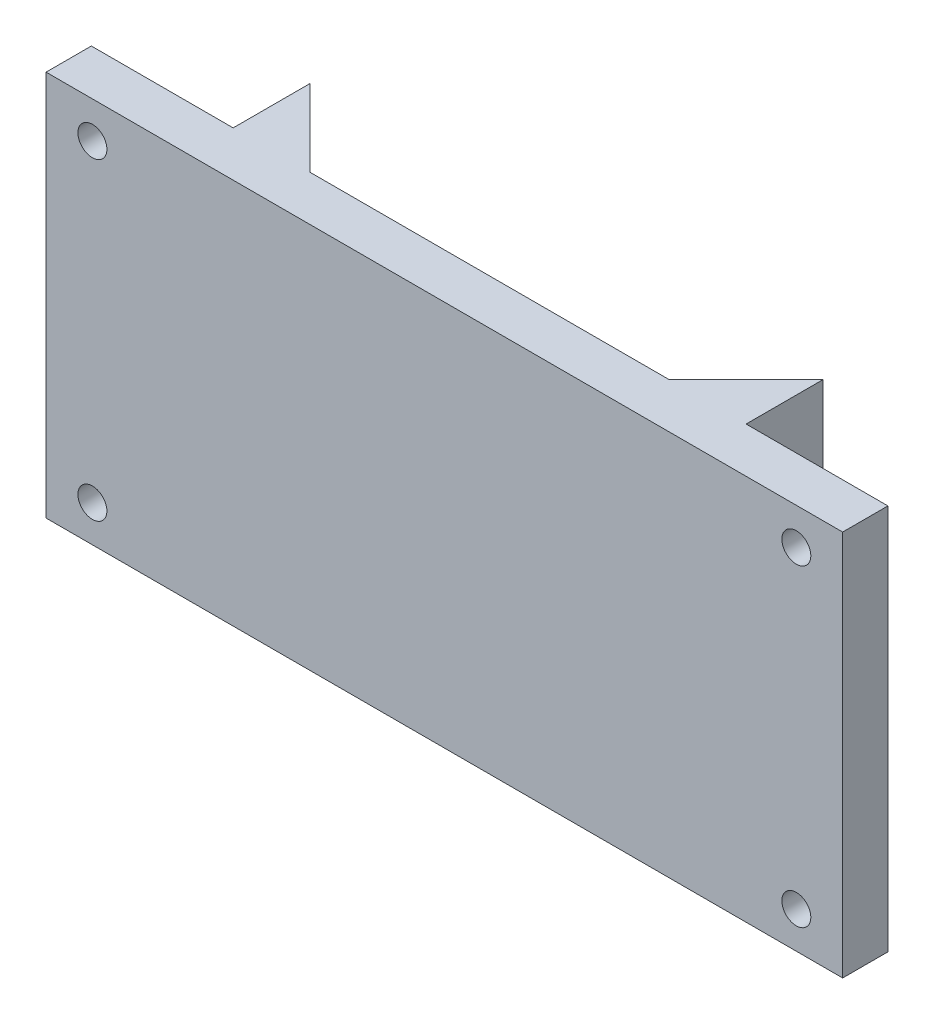
ISO-10303-21;
HEADER;
FILE_DESCRIPTION(('STEP AP214'),'2;1');
FILE_NAME('part.step','',(''),(''),'','','');
FILE_SCHEMA(('AUTOMOTIVE_DESIGN { 1 0 10303 214 1 1 1 1 }'));
ENDSEC;
DATA;
#1=APPLICATION_CONTEXT('core data for automotive mechanical design processes');
#2=APPLICATION_PROTOCOL_DEFINITION('international standard','automotive_design',2000,#1);
#3=PRODUCT_CONTEXT('',#1,'mechanical');
#4=PRODUCT('Part','Part','',(#3));
#5=PRODUCT_RELATED_PRODUCT_CATEGORY('part','',(#4));
#6=PRODUCT_DEFINITION_FORMATION('','',#4);
#7=PRODUCT_DEFINITION_CONTEXT('part definition',#1,'design');
#8=PRODUCT_DEFINITION('design','',#6,#7);
#9=PRODUCT_DEFINITION_SHAPE('','',#8);
#10=(LENGTH_UNIT() NAMED_UNIT(*) SI_UNIT(.MILLI.,.METRE.));
#11=(NAMED_UNIT(*) PLANE_ANGLE_UNIT() SI_UNIT($,.RADIAN.));
#12=(NAMED_UNIT(*) SI_UNIT($,.STERADIAN.) SOLID_ANGLE_UNIT());
#13=UNCERTAINTY_MEASURE_WITH_UNIT(LENGTH_MEASURE(1.E-05),#10,'distance_accuracy_value','');
#14=(GEOMETRIC_REPRESENTATION_CONTEXT(3) GLOBAL_UNCERTAINTY_ASSIGNED_CONTEXT((#13)) GLOBAL_UNIT_ASSIGNED_CONTEXT((#10,
#11,#12)) REPRESENTATION_CONTEXT('',''));
#15=CARTESIAN_POINT('',(0.,0.,0.));
#16=DIRECTION('',(0.,0.,1.));
#17=DIRECTION('',(1.,0.,0.));
#18=AXIS2_PLACEMENT_3D('',#15,#16,#17);
#19=CARTESIAN_POINT('',(0.,0.,3.75));
#20=DIRECTION('',(0.,0.,-1.));
#21=DIRECTION('',(-1.,0.,0.));
#22=AXIS2_PLACEMENT_3D('',#19,#20,#21);
#23=PLANE('',#22);
#24=CARTESIAN_POINT('',(-29.161731409782,-12.975,3.75));
#25=DIRECTION('',(0.,0.,1.));
#26=DIRECTION('',(1.,0.,0.));
#27=AXIS2_PLACEMENT_3D('',#24,#25,#26);
#28=CIRCLE('',#27,1.19999999999999);
#29=CARTESIAN_POINT('',(-27.961731409782,-12.975,3.75));
#30=VERTEX_POINT('',#29);
#31=EDGE_CURVE('E238',#30,#30,#28,.T.);
#32=ORIENTED_EDGE('',*,*,#31,.F.);
#33=EDGE_LOOP('',(#32));
#34=FACE_BOUND('',#33,.T.);
#35=CARTESIAN_POINT('',(-29.161731409782,12.975,3.75));
#36=DIRECTION('',(0.,0.,1.));
#37=DIRECTION('',(1.,0.,0.));
#38=AXIS2_PLACEMENT_3D('',#35,#36,#37);
#39=CIRCLE('',#38,1.19999999999999);
#40=CARTESIAN_POINT('',(-27.961731409782,12.975,3.75));
#41=VERTEX_POINT('',#40);
#42=EDGE_CURVE('E140',#41,#41,#39,.T.);
#43=ORIENTED_EDGE('',*,*,#42,.F.);
#44=EDGE_LOOP('',(#43));
#45=FACE_BOUND('',#44,.T.);
#46=DIRECTION('',(1.,0.,0.));
#47=VECTOR('',#46,1.);
#48=CARTESIAN_POINT('',(-25.,-16.,3.75));
#49=LINE('',#48,#47);
#50=CARTESIAN_POINT('',(-33.,-16.,3.75));
#51=VERTEX_POINT('',#50);
#52=CARTESIAN_POINT('',(33.,-16.,3.75));
#53=VERTEX_POINT('',#52);
#54=EDGE_CURVE('E11',#51,#53,#49,.T.);
#55=ORIENTED_EDGE('',*,*,#54,.T.);
#56=DIRECTION('',(0.,1.,0.));
#57=VECTOR('',#56,1.);
#58=CARTESIAN_POINT('',(33.,-24.8352985235362,3.75));
#59=LINE('',#58,#57);
#60=CARTESIAN_POINT('',(33.,16.,3.75));
#61=VERTEX_POINT('',#60);
#62=EDGE_CURVE('E154',#53,#61,#59,.T.);
#63=ORIENTED_EDGE('',*,*,#62,.T.);
#64=DIRECTION('',(-1.,0.,0.));
#65=VECTOR('',#64,1.);
#66=CARTESIAN_POINT('',(-25.,16.,3.75));
#67=LINE('',#66,#65);
#68=CARTESIAN_POINT('',(-33.,16.,3.75));
#69=VERTEX_POINT('',#68);
#70=EDGE_CURVE('E43',#61,#69,#67,.T.);
#71=ORIENTED_EDGE('',*,*,#70,.T.);
#72=DIRECTION('',(0.,1.,0.));
#73=VECTOR('',#72,1.);
#74=CARTESIAN_POINT('',(-33.,-24.8352985235362,3.75));
#75=LINE('',#74,#73);
#76=EDGE_CURVE('E132',#51,#69,#75,.T.);
#77=ORIENTED_EDGE('',*,*,#76,.F.);
#78=EDGE_LOOP('',(#55,#63,#71,#77));
#79=FACE_BOUND('',#78,.T.);
#80=CARTESIAN_POINT('',(29.161731409782,12.975,3.75));
#81=DIRECTION('',(0.,0.,1.));
#82=DIRECTION('',(1.,0.,0.));
#83=AXIS2_PLACEMENT_3D('',#80,#81,#82);
#84=CIRCLE('',#83,1.19999999999999);
#85=CARTESIAN_POINT('',(30.361731409782,12.975,3.75));
#86=VERTEX_POINT('',#85);
#87=EDGE_CURVE('E224',#86,#86,#84,.T.);
#88=ORIENTED_EDGE('',*,*,#87,.F.);
#89=EDGE_LOOP('',(#88));
#90=FACE_BOUND('',#89,.T.);
#91=CARTESIAN_POINT('',(29.161731409782,-12.975,3.75));
#92=DIRECTION('',(0.,0.,1.));
#93=DIRECTION('',(1.,0.,0.));
#94=AXIS2_PLACEMENT_3D('',#91,#92,#93);
#95=CIRCLE('',#94,1.19999999999999);
#96=CARTESIAN_POINT('',(30.361731409782,-12.975,3.75));
#97=VERTEX_POINT('',#96);
#98=EDGE_CURVE('E227',#97,#97,#95,.T.);
#99=ORIENTED_EDGE('',*,*,#98,.F.);
#100=EDGE_LOOP('',(#99));
#101=FACE_BOUND('',#100,.T.);
#102=ADVANCED_FACE('F34',(#34,#45,#79,#90,#101),#23,.F.);
#103=CARTESIAN_POINT('',(0.,0.,0.));
#104=DIRECTION('',(0.,0.,-1.));
#105=DIRECTION('',(-1.,0.,0.));
#106=AXIS2_PLACEMENT_3D('',#103,#104,#105);
#107=PLANE('',#106);
#108=DIRECTION('',(0.,1.,0.));
#109=VECTOR('',#108,1.);
#110=CARTESIAN_POINT('',(14.8860389693211,-25.,0.));
#111=LINE('',#110,#109);
#112=CARTESIAN_POINT('',(14.8860389693211,-16.,0.));
#113=VERTEX_POINT('',#112);
#114=CARTESIAN_POINT('',(14.8860389693211,16.,0.));
#115=VERTEX_POINT('',#114);
#116=EDGE_CURVE('E169',#113,#115,#111,.T.);
#117=ORIENTED_EDGE('',*,*,#116,.F.);
#118=DIRECTION('',(1.,0.,0.));
#119=VECTOR('',#118,1.);
#120=CARTESIAN_POINT('',(-25.,-16.,0.));
#121=LINE('',#120,#119);
#122=CARTESIAN_POINT('',(-14.8860389693211,-16.,0.));
#123=VERTEX_POINT('',#122);
#124=EDGE_CURVE('E186',#123,#113,#121,.T.);
#125=ORIENTED_EDGE('',*,*,#124,.F.);
#126=DIRECTION('',(0.,1.,0.));
#127=VECTOR('',#126,1.);
#128=CARTESIAN_POINT('',(-14.8860389693211,-25.,0.));
#129=LINE('',#128,#127);
#130=CARTESIAN_POINT('',(-14.8860389693211,16.,0.));
#131=VERTEX_POINT('',#130);
#132=EDGE_CURVE('E178',#123,#131,#129,.T.);
#133=ORIENTED_EDGE('',*,*,#132,.T.);
#134=DIRECTION('',(-1.,0.,0.));
#135=VECTOR('',#134,1.);
#136=CARTESIAN_POINT('',(-25.,16.,0.));
#137=LINE('',#136,#135);
#138=EDGE_CURVE('E59',#115,#131,#137,.T.);
#139=ORIENTED_EDGE('',*,*,#138,.F.);
#140=EDGE_LOOP('',(#117,#125,#133,#139));
#141=FACE_BOUND('',#140,.T.);
#142=ADVANCED_FACE('F203',(#141),#107,.T.);
#143=CARTESIAN_POINT('',(29.161731409782,-12.975,0.));
#144=DIRECTION('',(0.,0.,-1.));
#145=DIRECTION('',(-1.,0.,0.));
#146=AXIS2_PLACEMENT_3D('',#143,#144,#145);
#147=CIRCLE('',#146,1.19999999999999);
#148=CARTESIAN_POINT('',(27.961731409782,-12.975,0.));
#149=VERTEX_POINT('',#148);
#150=EDGE_CURVE('E229',#149,#149,#147,.T.);
#151=ORIENTED_EDGE('',*,*,#150,.F.);
#152=EDGE_LOOP('',(#151));
#153=FACE_BOUND('',#152,.T.);
#154=CARTESIAN_POINT('',(29.161731409782,12.975,0.));
#155=DIRECTION('',(0.,0.,-1.));
#156=DIRECTION('',(-1.,0.,0.));
#157=AXIS2_PLACEMENT_3D('',#154,#155,#156);
#158=CIRCLE('',#157,1.19999999999999);
#159=CARTESIAN_POINT('',(27.961731409782,12.975,0.));
#160=VERTEX_POINT('',#159);
#161=EDGE_CURVE('E235',#160,#160,#158,.T.);
#162=ORIENTED_EDGE('',*,*,#161,.F.);
#163=EDGE_LOOP('',(#162));
#164=FACE_BOUND('',#163,.T.);
#165=DIRECTION('',(0.,1.,0.));
#166=VECTOR('',#165,1.);
#167=CARTESIAN_POINT('',(21.25,-25.,0.));
#168=LINE('',#167,#166);
#169=CARTESIAN_POINT('',(21.25,-16.,0.));
#170=VERTEX_POINT('',#169);
#171=CARTESIAN_POINT('',(21.25,16.,0.));
#172=VERTEX_POINT('',#171);
#173=EDGE_CURVE('E51',#170,#172,#168,.T.);
#174=ORIENTED_EDGE('',*,*,#173,.T.);
#175=CARTESIAN_POINT('',(33.,16.,0.));
#176=VERTEX_POINT('',#175);
#177=EDGE_CURVE('E124',#176,#172,#137,.T.);
#178=ORIENTED_EDGE('',*,*,#177,.F.);
#179=DIRECTION('',(0.,1.,0.));
#180=VECTOR('',#179,1.);
#181=CARTESIAN_POINT('',(33.,-24.8352985235362,0.));
#182=LINE('',#181,#180);
#183=CARTESIAN_POINT('',(33.,-16.,0.));
#184=VERTEX_POINT('',#183);
#185=EDGE_CURVE('E150',#184,#176,#182,.T.);
#186=ORIENTED_EDGE('',*,*,#185,.F.);
#187=EDGE_CURVE('E185',#170,#184,#121,.T.);
#188=ORIENTED_EDGE('',*,*,#187,.F.);
#189=EDGE_LOOP('',(#174,#178,#186,#188));
#190=FACE_BOUND('',#189,.T.);
#191=ADVANCED_FACE('F210',(#153,#164,#190),#107,.T.);
#192=CARTESIAN_POINT('',(-25.,16.,3.75));
#193=DIRECTION('',(0.,-1.,0.));
#194=DIRECTION('',(0.,0.,-1.));
#195=AXIS2_PLACEMENT_3D('',#192,#193,#194);
#196=PLANE('',#195);
#197=ORIENTED_EDGE('',*,*,#177,.T.);
#198=DIRECTION('',(0.,0.,-1.));
#199=VECTOR('',#198,1.);
#200=CARTESIAN_POINT('',(21.25,16.,0.));
#201=LINE('',#200,#199);
#202=CARTESIAN_POINT('',(21.25,16.,-6.36396103067893));
#203=VERTEX_POINT('',#202);
#204=EDGE_CURVE('E166',#172,#203,#201,.T.);
#205=ORIENTED_EDGE('',*,*,#204,.T.);
#206=DIRECTION('',(-0.707106781186548,0.,0.707106781186547));
#207=VECTOR('',#206,1.);
#208=CARTESIAN_POINT('',(21.25,16.,-6.36396103067893));
#209=LINE('',#208,#207);
#210=EDGE_CURVE('E149',#203,#115,#209,.T.);
#211=ORIENTED_EDGE('',*,*,#210,.T.);
#212=ORIENTED_EDGE('',*,*,#138,.T.);
#213=DIRECTION('',(-0.707106781186548,0.,-0.707106781186547));
#214=VECTOR('',#213,1.);
#215=CARTESIAN_POINT('',(-21.25,16.,-6.36396103067893));
#216=LINE('',#215,#214);
#217=CARTESIAN_POINT('',(-21.25,16.,-6.36396103067893));
#218=VERTEX_POINT('',#217);
#219=EDGE_CURVE('E164',#131,#218,#216,.T.);
#220=ORIENTED_EDGE('',*,*,#219,.T.);
#221=DIRECTION('',(0.,0.,1.));
#222=VECTOR('',#221,1.);
#223=CARTESIAN_POINT('',(-21.25,16.,0.));
#224=LINE('',#223,#222);
#225=CARTESIAN_POINT('',(-21.25,16.,0.));
#226=VERTEX_POINT('',#225);
#227=EDGE_CURVE('E120',#218,#226,#224,.T.);
#228=ORIENTED_EDGE('',*,*,#227,.T.);
#229=CARTESIAN_POINT('',(-33.,16.,0.));
#230=VERTEX_POINT('',#229);
#231=EDGE_CURVE('E114',#226,#230,#137,.T.);
#232=ORIENTED_EDGE('',*,*,#231,.T.);
#233=DIRECTION('',(0.,0.,1.));
#234=VECTOR('',#233,1.);
#235=CARTESIAN_POINT('',(-33.,16.,3.75));
#236=LINE('',#235,#234);
#237=EDGE_CURVE('E118',#230,#69,#236,.T.);
#238=ORIENTED_EDGE('',*,*,#237,.T.);
#239=ORIENTED_EDGE('',*,*,#70,.F.);
#240=DIRECTION('',(0.,0.,-1.));
#241=VECTOR('',#240,1.);
#242=CARTESIAN_POINT('',(33.,16.,3.75));
#243=LINE('',#242,#241);
#244=EDGE_CURVE('E151',#61,#176,#243,.T.);
#245=ORIENTED_EDGE('',*,*,#244,.T.);
#246=EDGE_LOOP('',(#197,#205,#211,#212,#220,#228,#232,#238,#239,#245));
#247=FACE_BOUND('',#246,.T.);
#248=ADVANCED_FACE('F36',(#247),#196,.F.);
#249=CARTESIAN_POINT('',(-25.,-16.,3.75));
#250=DIRECTION('',(0.,1.,0.));
#251=DIRECTION('',(0.,0.,1.));
#252=AXIS2_PLACEMENT_3D('',#249,#250,#251);
#253=PLANE('',#252);
#254=CARTESIAN_POINT('',(-33.,-16.,0.));
#255=VERTEX_POINT('',#254);
#256=CARTESIAN_POINT('',(-21.25,-16.,0.));
#257=VERTEX_POINT('',#256);
#258=EDGE_CURVE('E38',#255,#257,#121,.T.);
#259=ORIENTED_EDGE('',*,*,#258,.T.);
#260=DIRECTION('',(0.,0.,-1.));
#261=VECTOR('',#260,1.);
#262=CARTESIAN_POINT('',(-21.25,-16.,0.));
#263=LINE('',#262,#261);
#264=CARTESIAN_POINT('',(-21.25,-16.,-6.36396103067893));
#265=VERTEX_POINT('',#264);
#266=EDGE_CURVE('E173',#257,#265,#263,.T.);
#267=ORIENTED_EDGE('',*,*,#266,.T.);
#268=DIRECTION('',(0.707106781186548,0.,0.707106781186547));
#269=VECTOR('',#268,1.);
#270=CARTESIAN_POINT('',(-21.25,-16.,-6.36396103067893));
#271=LINE('',#270,#269);
#272=EDGE_CURVE('E123',#265,#123,#271,.T.);
#273=ORIENTED_EDGE('',*,*,#272,.T.);
#274=ORIENTED_EDGE('',*,*,#124,.T.);
#275=DIRECTION('',(0.707106781186548,0.,-0.707106781186547));
#276=VECTOR('',#275,1.);
#277=CARTESIAN_POINT('',(21.25,-16.,-6.36396103067893));
#278=LINE('',#277,#276);
#279=CARTESIAN_POINT('',(21.25,-16.,-6.36396103067893));
#280=VERTEX_POINT('',#279);
#281=EDGE_CURVE('E161',#113,#280,#278,.T.);
#282=ORIENTED_EDGE('',*,*,#281,.T.);
#283=DIRECTION('',(0.,0.,1.));
#284=VECTOR('',#283,1.);
#285=CARTESIAN_POINT('',(21.25,-16.,0.));
#286=LINE('',#285,#284);
#287=EDGE_CURVE('E159',#280,#170,#286,.T.);
#288=ORIENTED_EDGE('',*,*,#287,.T.);
#289=ORIENTED_EDGE('',*,*,#187,.T.);
#290=DIRECTION('',(0.,0.,1.));
#291=VECTOR('',#290,1.);
#292=CARTESIAN_POINT('',(33.,-16.,3.75));
#293=LINE('',#292,#291);
#294=EDGE_CURVE('E146',#184,#53,#293,.T.);
#295=ORIENTED_EDGE('',*,*,#294,.T.);
#296=ORIENTED_EDGE('',*,*,#54,.F.);
#297=DIRECTION('',(0.,0.,-1.));
#298=VECTOR('',#297,1.);
#299=CARTESIAN_POINT('',(-33.,-16.,3.75));
#300=LINE('',#299,#298);
#301=EDGE_CURVE('E144',#51,#255,#300,.T.);
#302=ORIENTED_EDGE('',*,*,#301,.T.);
#303=EDGE_LOOP('',(#259,#267,#273,#274,#282,#288,#289,#295,#296,#302));
#304=FACE_BOUND('',#303,.T.);
#305=ADVANCED_FACE('F192',(#304),#253,.F.);
#306=CARTESIAN_POINT('',(-29.161731409782,-12.975,0.));
#307=DIRECTION('',(0.,0.,-1.));
#308=DIRECTION('',(-1.,0.,0.));
#309=AXIS2_PLACEMENT_3D('',#306,#307,#308);
#310=CIRCLE('',#309,1.19999999999999);
#311=CARTESIAN_POINT('',(-30.361731409782,-12.975,0.));
#312=VERTEX_POINT('',#311);
#313=EDGE_CURVE('E241',#312,#312,#310,.T.);
#314=ORIENTED_EDGE('',*,*,#313,.F.);
#315=EDGE_LOOP('',(#314));
#316=FACE_BOUND('',#315,.T.);
#317=CARTESIAN_POINT('',(-29.161731409782,12.975,0.));
#318=DIRECTION('',(0.,0.,-1.));
#319=DIRECTION('',(-1.,0.,0.));
#320=AXIS2_PLACEMENT_3D('',#317,#318,#319);
#321=CIRCLE('',#320,1.19999999999999);
#322=CARTESIAN_POINT('',(-30.361731409782,12.975,0.));
#323=VERTEX_POINT('',#322);
#324=EDGE_CURVE('E137',#323,#323,#321,.T.);
#325=ORIENTED_EDGE('',*,*,#324,.F.);
#326=EDGE_LOOP('',(#325));
#327=FACE_BOUND('',#326,.T.);
#328=DIRECTION('',(0.,1.,0.));
#329=VECTOR('',#328,1.);
#330=CARTESIAN_POINT('',(-21.25,-25.,0.));
#331=LINE('',#330,#329);
#332=EDGE_CURVE('E175',#257,#226,#331,.T.);
#333=ORIENTED_EDGE('',*,*,#332,.F.);
#334=ORIENTED_EDGE('',*,*,#258,.F.);
#335=DIRECTION('',(0.,1.,0.));
#336=VECTOR('',#335,1.);
#337=CARTESIAN_POINT('',(-33.,-24.8352985235362,0.));
#338=LINE('',#337,#336);
#339=EDGE_CURVE('E126',#255,#230,#338,.T.);
#340=ORIENTED_EDGE('',*,*,#339,.T.);
#341=ORIENTED_EDGE('',*,*,#231,.F.);
#342=EDGE_LOOP('',(#333,#334,#340,#341));
#343=FACE_BOUND('',#342,.T.);
#344=ADVANCED_FACE('F127',(#316,#327,#343),#107,.T.);
#345=CARTESIAN_POINT('',(-21.25,-25.,0.));
#346=DIRECTION('',(-1.,0.,0.));
#347=DIRECTION('',(0.,0.,1.));
#348=AXIS2_PLACEMENT_3D('',#345,#346,#347);
#349=PLANE('',#348);
#350=ORIENTED_EDGE('',*,*,#266,.F.);
#351=ORIENTED_EDGE('',*,*,#332,.T.);
#352=ORIENTED_EDGE('',*,*,#227,.F.);
#353=DIRECTION('',(0.,1.,0.));
#354=VECTOR('',#353,1.);
#355=CARTESIAN_POINT('',(-21.25,-25.,-6.36396103067893));
#356=LINE('',#355,#354);
#357=EDGE_CURVE('E180',#265,#218,#356,.T.);
#358=ORIENTED_EDGE('',*,*,#357,.F.);
#359=EDGE_LOOP('',(#350,#351,#352,#358));
#360=FACE_BOUND('',#359,.T.);
#361=ADVANCED_FACE('F195',(#360),#349,.T.);
#362=CARTESIAN_POINT('',(-21.25,-25.,-6.36396103067893));
#363=DIRECTION('',(0.707106781186547,0.,-0.707106781186548));
#364=DIRECTION('',(-0.707106781186548,0.,-0.707106781186547));
#365=AXIS2_PLACEMENT_3D('',#362,#363,#364);
#366=PLANE('',#365);
#367=ORIENTED_EDGE('',*,*,#272,.F.);
#368=ORIENTED_EDGE('',*,*,#357,.T.);
#369=ORIENTED_EDGE('',*,*,#219,.F.);
#370=ORIENTED_EDGE('',*,*,#132,.F.);
#371=EDGE_LOOP('',(#367,#368,#369,#370));
#372=FACE_BOUND('',#371,.T.);
#373=ADVANCED_FACE('F200',(#372),#366,.T.);
#374=CARTESIAN_POINT('',(21.25,-25.,-6.36396103067893));
#375=DIRECTION('',(-0.707106781186547,0.,-0.707106781186548));
#376=DIRECTION('',(-0.707106781186548,0.,0.707106781186547));
#377=AXIS2_PLACEMENT_3D('',#374,#375,#376);
#378=PLANE('',#377);
#379=ORIENTED_EDGE('',*,*,#281,.F.);
#380=ORIENTED_EDGE('',*,*,#116,.T.);
#381=ORIENTED_EDGE('',*,*,#210,.F.);
#382=DIRECTION('',(0.,1.,0.));
#383=VECTOR('',#382,1.);
#384=CARTESIAN_POINT('',(21.25,-25.,-6.36396103067893));
#385=LINE('',#384,#383);
#386=EDGE_CURVE('E162',#280,#203,#385,.T.);
#387=ORIENTED_EDGE('',*,*,#386,.F.);
#388=EDGE_LOOP('',(#379,#380,#381,#387));
#389=FACE_BOUND('',#388,.T.);
#390=ADVANCED_FACE('F206',(#389),#378,.T.);
#391=CARTESIAN_POINT('',(21.25,-25.,0.));
#392=DIRECTION('',(1.,0.,0.));
#393=DIRECTION('',(0.,0.,-1.));
#394=AXIS2_PLACEMENT_3D('',#391,#392,#393);
#395=PLANE('',#394);
#396=ORIENTED_EDGE('',*,*,#287,.F.);
#397=ORIENTED_EDGE('',*,*,#386,.T.);
#398=ORIENTED_EDGE('',*,*,#204,.F.);
#399=ORIENTED_EDGE('',*,*,#173,.F.);
#400=EDGE_LOOP('',(#396,#397,#398,#399));
#401=FACE_BOUND('',#400,.T.);
#402=ADVANCED_FACE('F208',(#401),#395,.T.);
#403=CARTESIAN_POINT('',(33.,-24.8352985235362,3.75));
#404=DIRECTION('',(1.,0.,0.));
#405=DIRECTION('',(0.,0.,-1.));
#406=AXIS2_PLACEMENT_3D('',#403,#404,#405);
#407=PLANE('',#406);
#408=ORIENTED_EDGE('',*,*,#294,.F.);
#409=ORIENTED_EDGE('',*,*,#185,.T.);
#410=ORIENTED_EDGE('',*,*,#244,.F.);
#411=ORIENTED_EDGE('',*,*,#62,.F.);
#412=EDGE_LOOP('',(#408,#409,#410,#411));
#413=FACE_BOUND('',#412,.T.);
#414=ADVANCED_FACE('F214',(#413),#407,.T.);
#415=CARTESIAN_POINT('',(-33.,-24.8352985235362,3.75));
#416=DIRECTION('',(-1.,0.,0.));
#417=DIRECTION('',(0.,0.,1.));
#418=AXIS2_PLACEMENT_3D('',#415,#416,#417);
#419=PLANE('',#418);
#420=ORIENTED_EDGE('',*,*,#301,.F.);
#421=ORIENTED_EDGE('',*,*,#76,.T.);
#422=ORIENTED_EDGE('',*,*,#237,.F.);
#423=ORIENTED_EDGE('',*,*,#339,.F.);
#424=EDGE_LOOP('',(#420,#421,#422,#423));
#425=FACE_BOUND('',#424,.T.);
#426=ADVANCED_FACE('F135',(#425),#419,.T.);
#427=CARTESIAN_POINT('',(-29.161731409782,12.975,3.75));
#428=DIRECTION('',(0.,0.,1.));
#429=DIRECTION('',(1.,0.,0.));
#430=AXIS2_PLACEMENT_3D('',#427,#428,#429);
#431=CYLINDRICAL_SURFACE('',#430,1.19999999999999);
#432=ORIENTED_EDGE('',*,*,#42,.T.);
#433=EDGE_LOOP('',(#432));
#434=FACE_BOUND('',#433,.T.);
#435=ORIENTED_EDGE('',*,*,#324,.T.);
#436=EDGE_LOOP('',(#435));
#437=FACE_BOUND('',#436,.T.);
#438=ADVANCED_FACE('F247',(#434,#437),#431,.F.);
#439=CARTESIAN_POINT('',(-29.161731409782,-12.975,3.75));
#440=DIRECTION('',(0.,0.,1.));
#441=DIRECTION('',(1.,0.,0.));
#442=AXIS2_PLACEMENT_3D('',#439,#440,#441);
#443=CYLINDRICAL_SURFACE('',#442,1.19999999999999);
#444=ORIENTED_EDGE('',*,*,#31,.T.);
#445=EDGE_LOOP('',(#444));
#446=FACE_BOUND('',#445,.T.);
#447=ORIENTED_EDGE('',*,*,#313,.T.);
#448=EDGE_LOOP('',(#447));
#449=FACE_BOUND('',#448,.T.);
#450=ADVANCED_FACE('F251',(#446,#449),#443,.F.);
#451=CARTESIAN_POINT('',(29.161731409782,12.975,3.75));
#452=DIRECTION('',(0.,0.,1.));
#453=DIRECTION('',(1.,0.,0.));
#454=AXIS2_PLACEMENT_3D('',#451,#452,#453);
#455=CYLINDRICAL_SURFACE('',#454,1.19999999999999);
#456=ORIENTED_EDGE('',*,*,#87,.T.);
#457=EDGE_LOOP('',(#456));
#458=FACE_BOUND('',#457,.T.);
#459=ORIENTED_EDGE('',*,*,#161,.T.);
#460=EDGE_LOOP('',(#459));
#461=FACE_BOUND('',#460,.T.);
#462=ADVANCED_FACE('F274',(#458,#461),#455,.F.);
#463=CARTESIAN_POINT('',(29.161731409782,-12.975,3.75));
#464=DIRECTION('',(0.,0.,1.));
#465=DIRECTION('',(1.,0.,0.));
#466=AXIS2_PLACEMENT_3D('',#463,#464,#465);
#467=CYLINDRICAL_SURFACE('',#466,1.19999999999999);
#468=ORIENTED_EDGE('',*,*,#98,.T.);
#469=EDGE_LOOP('',(#468));
#470=FACE_BOUND('',#469,.T.);
#471=ORIENTED_EDGE('',*,*,#150,.T.);
#472=EDGE_LOOP('',(#471));
#473=FACE_BOUND('',#472,.T.);
#474=ADVANCED_FACE('F276',(#470,#473),#467,.F.);
#475=CLOSED_SHELL('',(#102,#142,#191,#248,#305,#344,#361,#373,#390,#402,#414,#426,#438,#450,
#462,#474));
#476=MANIFOLD_SOLID_BREP('B2',#475);
#477=ADVANCED_BREP_SHAPE_REPRESENTATION('',(#18,#476),#14);
#478=SHAPE_DEFINITION_REPRESENTATION(#9,#477);
ENDSEC;
END-ISO-10303-21;
